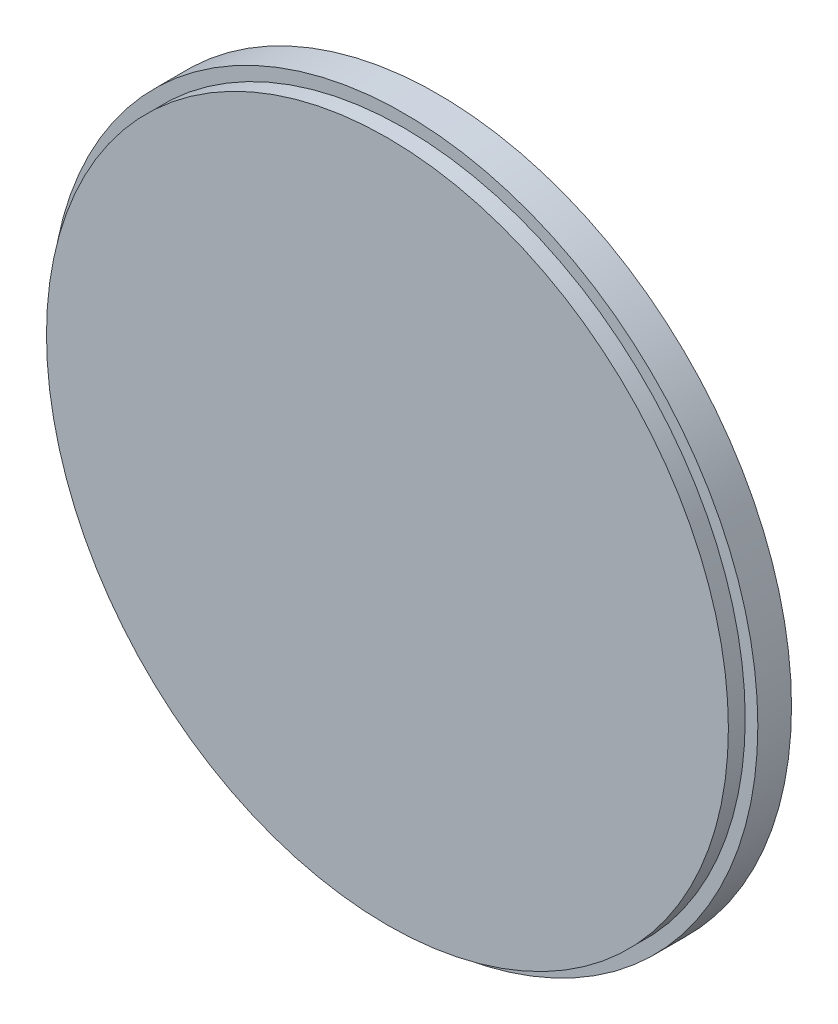
ISO-10303-21;
HEADER;
FILE_DESCRIPTION(('STEP AP214'),'2;1');
FILE_NAME('part.step','',(''),(''),'','','');
FILE_SCHEMA(('AUTOMOTIVE_DESIGN { 1 0 10303 214 1 1 1 1 }'));
ENDSEC;
DATA;
#1=APPLICATION_CONTEXT('core data for automotive mechanical design processes');
#2=APPLICATION_PROTOCOL_DEFINITION('international standard','automotive_design',2000,#1);
#3=PRODUCT_CONTEXT('',#1,'mechanical');
#4=PRODUCT('Part','Part','',(#3));
#5=PRODUCT_RELATED_PRODUCT_CATEGORY('part','',(#4));
#6=PRODUCT_DEFINITION_FORMATION('','',#4);
#7=PRODUCT_DEFINITION_CONTEXT('part definition',#1,'design');
#8=PRODUCT_DEFINITION('design','',#6,#7);
#9=PRODUCT_DEFINITION_SHAPE('','',#8);
#10=(LENGTH_UNIT() NAMED_UNIT(*) SI_UNIT(.MILLI.,.METRE.));
#11=(NAMED_UNIT(*) PLANE_ANGLE_UNIT() SI_UNIT($,.RADIAN.));
#12=(NAMED_UNIT(*) SI_UNIT($,.STERADIAN.) SOLID_ANGLE_UNIT());
#13=UNCERTAINTY_MEASURE_WITH_UNIT(LENGTH_MEASURE(1.E-05),#10,'distance_accuracy_value','');
#14=(GEOMETRIC_REPRESENTATION_CONTEXT(3) GLOBAL_UNCERTAINTY_ASSIGNED_CONTEXT((#13)) GLOBAL_UNIT_ASSIGNED_CONTEXT((#10,
#11,#12)) REPRESENTATION_CONTEXT('',''));
#15=CARTESIAN_POINT('',(0.,0.,0.));
#16=DIRECTION('',(0.,0.,1.));
#17=DIRECTION('',(1.,0.,0.));
#18=AXIS2_PLACEMENT_3D('',#15,#16,#17);
#19=CARTESIAN_POINT('',(0.,0.,2.));
#20=DIRECTION('',(0.,0.,-1.));
#21=DIRECTION('',(-1.,0.,0.));
#22=AXIS2_PLACEMENT_3D('',#19,#20,#21);
#23=CYLINDRICAL_SURFACE('',#22,21.);
#24=CARTESIAN_POINT('',(0.,0.,2.));
#25=DIRECTION('',(0.,0.,1.));
#26=DIRECTION('',(1.,0.,0.));
#27=AXIS2_PLACEMENT_3D('',#24,#25,#26);
#28=CIRCLE('',#27,21.);
#29=CARTESIAN_POINT('',(21.,0.,2.));
#30=VERTEX_POINT('',#29);
#31=EDGE_CURVE('E45',#30,#30,#28,.T.);
#32=ORIENTED_EDGE('',*,*,#31,.F.);
#33=EDGE_LOOP('',(#32));
#34=FACE_BOUND('',#33,.T.);
#35=CARTESIAN_POINT('',(0.,0.,0.));
#36=DIRECTION('',(0.,0.,1.));
#37=DIRECTION('',(1.,0.,0.));
#38=AXIS2_PLACEMENT_3D('',#35,#36,#37);
#39=CIRCLE('',#38,21.);
#40=CARTESIAN_POINT('',(21.,0.,0.));
#41=VERTEX_POINT('',#40);
#42=EDGE_CURVE('E40',#41,#41,#39,.T.);
#43=ORIENTED_EDGE('',*,*,#42,.T.);
#44=EDGE_LOOP('',(#43));
#45=FACE_BOUND('',#44,.T.);
#46=ADVANCED_FACE('F37',(#34,#45),#23,.T.);
#47=CARTESIAN_POINT('',(0.,0.,2.));
#48=DIRECTION('',(0.,0.,1.));
#49=DIRECTION('',(1.,0.,0.));
#50=AXIS2_PLACEMENT_3D('',#47,#48,#49);
#51=PLANE('',#50);
#52=CARTESIAN_POINT('',(0.,0.,2.));
#53=DIRECTION('',(0.,0.,1.));
#54=DIRECTION('',(1.,0.,0.));
#55=AXIS2_PLACEMENT_3D('',#52,#53,#54);
#56=CIRCLE('',#55,20.25);
#57=CARTESIAN_POINT('',(20.25,0.,2.));
#58=VERTEX_POINT('',#57);
#59=EDGE_CURVE('E10',#58,#58,#56,.T.);
#60=ORIENTED_EDGE('',*,*,#59,.F.);
#61=EDGE_LOOP('',(#60));
#62=FACE_BOUND('',#61,.T.);
#63=ORIENTED_EDGE('',*,*,#31,.T.);
#64=EDGE_LOOP('',(#63));
#65=FACE_BOUND('',#64,.T.);
#66=ADVANCED_FACE('F65',(#62,#65),#51,.T.);
#67=CARTESIAN_POINT('',(0.,0.,0.));
#68=DIRECTION('',(0.,0.,1.));
#69=DIRECTION('',(1.,0.,0.));
#70=AXIS2_PLACEMENT_3D('',#67,#68,#69);
#71=PLANE('',#70);
#72=ORIENTED_EDGE('',*,*,#42,.F.);
#73=EDGE_LOOP('',(#72));
#74=FACE_BOUND('',#73,.T.);
#75=ADVANCED_FACE('F62',(#74),#71,.F.);
#76=CARTESIAN_POINT('',(0.,0.,3.));
#77=DIRECTION('',(0.,0.,-1.));
#78=DIRECTION('',(-1.,0.,0.));
#79=AXIS2_PLACEMENT_3D('',#76,#77,#78);
#80=CYLINDRICAL_SURFACE('',#79,20.25);
#81=CARTESIAN_POINT('',(0.,0.,3.));
#82=DIRECTION('',(0.,0.,1.));
#83=DIRECTION('',(1.,0.,0.));
#84=AXIS2_PLACEMENT_3D('',#81,#82,#83);
#85=CIRCLE('',#84,20.25);
#86=CARTESIAN_POINT('',(20.25,0.,3.));
#87=VERTEX_POINT('',#86);
#88=EDGE_CURVE('E52',#87,#87,#85,.T.);
#89=ORIENTED_EDGE('',*,*,#88,.F.);
#90=EDGE_LOOP('',(#89));
#91=FACE_BOUND('',#90,.T.);
#92=ORIENTED_EDGE('',*,*,#59,.T.);
#93=EDGE_LOOP('',(#92));
#94=FACE_BOUND('',#93,.T.);
#95=ADVANCED_FACE('F64',(#91,#94),#80,.T.);
#96=CARTESIAN_POINT('',(0.,0.,3.));
#97=DIRECTION('',(0.,0.,1.));
#98=DIRECTION('',(1.,0.,0.));
#99=AXIS2_PLACEMENT_3D('',#96,#97,#98);
#100=PLANE('',#99);
#101=ORIENTED_EDGE('',*,*,#88,.T.);
#102=EDGE_LOOP('',(#101));
#103=FACE_BOUND('',#102,.T.);
#104=ADVANCED_FACE('F70',(#103),#100,.T.);
#105=CLOSED_SHELL('',(#46,#66,#75,#95,#104));
#106=MANIFOLD_SOLID_BREP('B2',#105);
#107=ADVANCED_BREP_SHAPE_REPRESENTATION('',(#18,#106),#14);
#108=SHAPE_DEFINITION_REPRESENTATION(#9,#107);
ENDSEC;
END-ISO-10303-21;
